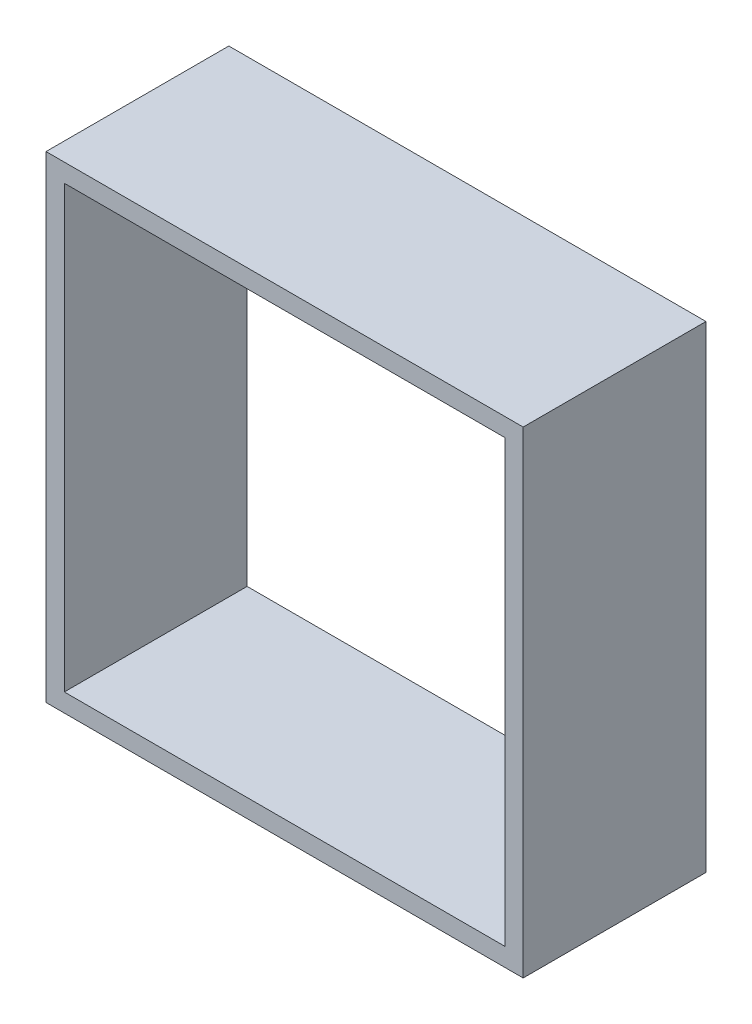
ISO-10303-21;
HEADER;
FILE_DESCRIPTION(('STEP AP214'),'2;1');
FILE_NAME('part.step','',(''),(''),'','','');
FILE_SCHEMA(('AUTOMOTIVE_DESIGN { 1 0 10303 214 1 1 1 1 }'));
ENDSEC;
DATA;
#1=APPLICATION_CONTEXT('core data for automotive mechanical design processes');
#2=APPLICATION_PROTOCOL_DEFINITION('international standard','automotive_design',2000,#1);
#3=PRODUCT_CONTEXT('',#1,'mechanical');
#4=PRODUCT('Part','Part','',(#3));
#5=PRODUCT_RELATED_PRODUCT_CATEGORY('part','',(#4));
#6=PRODUCT_DEFINITION_FORMATION('','',#4);
#7=PRODUCT_DEFINITION_CONTEXT('part definition',#1,'design');
#8=PRODUCT_DEFINITION('design','',#6,#7);
#9=PRODUCT_DEFINITION_SHAPE('','',#8);
#10=(LENGTH_UNIT() NAMED_UNIT(*) SI_UNIT(.MILLI.,.METRE.));
#11=(NAMED_UNIT(*) PLANE_ANGLE_UNIT() SI_UNIT($,.RADIAN.));
#12=(NAMED_UNIT(*) SI_UNIT($,.STERADIAN.) SOLID_ANGLE_UNIT());
#13=UNCERTAINTY_MEASURE_WITH_UNIT(LENGTH_MEASURE(1.E-05),#10,'distance_accuracy_value','');
#14=(GEOMETRIC_REPRESENTATION_CONTEXT(3) GLOBAL_UNCERTAINTY_ASSIGNED_CONTEXT((#13)) GLOBAL_UNIT_ASSIGNED_CONTEXT((#10,
#11,#12)) REPRESENTATION_CONTEXT('',''));
#15=CARTESIAN_POINT('',(0.,0.,0.));
#16=DIRECTION('',(0.,0.,1.));
#17=DIRECTION('',(1.,0.,0.));
#18=AXIS2_PLACEMENT_3D('',#15,#16,#17);
#19=CARTESIAN_POINT('',(0.,0.,5.));
#20=DIRECTION('',(0.,0.,1.));
#21=DIRECTION('',(1.,0.,0.));
#22=AXIS2_PLACEMENT_3D('',#19,#20,#21);
#23=PLANE('',#22);
#24=DIRECTION('',(1.,0.,0.));
#25=VECTOR('',#24,1.);
#26=CARTESIAN_POINT('',(-6.525,-6.525,5.));
#27=LINE('',#26,#25);
#28=CARTESIAN_POINT('',(-6.525,-6.525,5.));
#29=VERTEX_POINT('',#28);
#30=CARTESIAN_POINT('',(6.525,-6.525,5.));
#31=VERTEX_POINT('',#30);
#32=EDGE_CURVE('E134',#29,#31,#27,.T.);
#33=ORIENTED_EDGE('',*,*,#32,.T.);
#34=DIRECTION('',(0.,1.,0.));
#35=VECTOR('',#34,1.);
#36=CARTESIAN_POINT('',(6.525,-6.525,5.));
#37=LINE('',#36,#35);
#38=CARTESIAN_POINT('',(6.525,6.525,5.));
#39=VERTEX_POINT('',#38);
#40=EDGE_CURVE('E137',#31,#39,#37,.T.);
#41=ORIENTED_EDGE('',*,*,#40,.T.);
#42=DIRECTION('',(-1.,0.,0.));
#43=VECTOR('',#42,1.);
#44=CARTESIAN_POINT('',(-6.525,6.525,5.));
#45=LINE('',#44,#43);
#46=CARTESIAN_POINT('',(-6.525,6.525,5.));
#47=VERTEX_POINT('',#46);
#48=EDGE_CURVE('E140',#39,#47,#45,.T.);
#49=ORIENTED_EDGE('',*,*,#48,.T.);
#50=DIRECTION('',(0.,-1.,0.));
#51=VECTOR('',#50,1.);
#52=CARTESIAN_POINT('',(-6.525,-6.525,5.));
#53=LINE('',#52,#51);
#54=EDGE_CURVE('E142',#47,#29,#53,.T.);
#55=ORIENTED_EDGE('',*,*,#54,.T.);
#56=EDGE_LOOP('',(#33,#41,#49,#55));
#57=FACE_BOUND('',#56,.T.);
#58=DIRECTION('',(1.,0.,0.));
#59=VECTOR('',#58,1.);
#60=CARTESIAN_POINT('',(-6.025,-6.025,5.));
#61=LINE('',#60,#59);
#62=CARTESIAN_POINT('',(-6.025,-6.025,5.));
#63=VERTEX_POINT('',#62);
#64=CARTESIAN_POINT('',(6.025,-6.025,5.));
#65=VERTEX_POINT('',#64);
#66=EDGE_CURVE('E106',#63,#65,#61,.T.);
#67=ORIENTED_EDGE('',*,*,#66,.F.);
#68=DIRECTION('',(0.,-1.,0.));
#69=VECTOR('',#68,1.);
#70=CARTESIAN_POINT('',(-6.025,-6.025,5.));
#71=LINE('',#70,#69);
#72=CARTESIAN_POINT('',(-6.025,6.025,5.));
#73=VERTEX_POINT('',#72);
#74=EDGE_CURVE('E98',#73,#63,#71,.T.);
#75=ORIENTED_EDGE('',*,*,#74,.F.);
#76=DIRECTION('',(-1.,0.,0.));
#77=VECTOR('',#76,1.);
#78=CARTESIAN_POINT('',(-6.025,6.025,5.));
#79=LINE('',#78,#77);
#80=CARTESIAN_POINT('',(6.025,6.025,5.));
#81=VERTEX_POINT('',#80);
#82=EDGE_CURVE('E120',#81,#73,#79,.T.);
#83=ORIENTED_EDGE('',*,*,#82,.F.);
#84=DIRECTION('',(0.,1.,0.));
#85=VECTOR('',#84,1.);
#86=CARTESIAN_POINT('',(6.025,-6.025,5.));
#87=LINE('',#86,#85);
#88=EDGE_CURVE('E118',#65,#81,#87,.T.);
#89=ORIENTED_EDGE('',*,*,#88,.F.);
#90=EDGE_LOOP('',(#67,#75,#83,#89));
#91=FACE_BOUND('',#90,.T.);
#92=ADVANCED_FACE('F33',(#57,#91),#23,.T.);
#93=CARTESIAN_POINT('',(0.,0.,0.));
#94=DIRECTION('',(0.,0.,1.));
#95=DIRECTION('',(1.,0.,0.));
#96=AXIS2_PLACEMENT_3D('',#93,#94,#95);
#97=PLANE('',#96);
#98=DIRECTION('',(1.,0.,0.));
#99=VECTOR('',#98,1.);
#100=CARTESIAN_POINT('',(-6.525,-6.525,0.));
#101=LINE('',#100,#99);
#102=CARTESIAN_POINT('',(-6.525,-6.525,0.));
#103=VERTEX_POINT('',#102);
#104=CARTESIAN_POINT('',(6.525,-6.525,0.));
#105=VERTEX_POINT('',#104);
#106=EDGE_CURVE('E114',#103,#105,#101,.T.);
#107=ORIENTED_EDGE('',*,*,#106,.F.);
#108=DIRECTION('',(0.,-1.,0.));
#109=VECTOR('',#108,1.);
#110=CARTESIAN_POINT('',(-6.525,-6.525,0.));
#111=LINE('',#110,#109);
#112=CARTESIAN_POINT('',(-6.525,6.525,0.));
#113=VERTEX_POINT('',#112);
#114=EDGE_CURVE('E138',#113,#103,#111,.T.);
#115=ORIENTED_EDGE('',*,*,#114,.F.);
#116=DIRECTION('',(-1.,0.,0.));
#117=VECTOR('',#116,1.);
#118=CARTESIAN_POINT('',(-6.525,6.525,0.));
#119=LINE('',#118,#117);
#120=CARTESIAN_POINT('',(6.525,6.525,0.));
#121=VERTEX_POINT('',#120);
#122=EDGE_CURVE('E149',#121,#113,#119,.T.);
#123=ORIENTED_EDGE('',*,*,#122,.F.);
#124=DIRECTION('',(0.,1.,0.));
#125=VECTOR('',#124,1.);
#126=CARTESIAN_POINT('',(6.525,-6.525,0.));
#127=LINE('',#126,#125);
#128=EDGE_CURVE('E147',#105,#121,#127,.T.);
#129=ORIENTED_EDGE('',*,*,#128,.F.);
#130=EDGE_LOOP('',(#107,#115,#123,#129));
#131=FACE_BOUND('',#130,.T.);
#132=DIRECTION('',(0.,-1.,0.));
#133=VECTOR('',#132,1.);
#134=CARTESIAN_POINT('',(-6.025,-6.025,0.));
#135=LINE('',#134,#133);
#136=CARTESIAN_POINT('',(-6.025,6.025,0.));
#137=VERTEX_POINT('',#136);
#138=CARTESIAN_POINT('',(-6.025,-6.025,0.));
#139=VERTEX_POINT('',#138);
#140=EDGE_CURVE('E56',#137,#139,#135,.T.);
#141=ORIENTED_EDGE('',*,*,#140,.T.);
#142=DIRECTION('',(1.,0.,0.));
#143=VECTOR('',#142,1.);
#144=CARTESIAN_POINT('',(-6.025,-6.025,0.));
#145=LINE('',#144,#143);
#146=CARTESIAN_POINT('',(6.025,-6.025,0.));
#147=VERTEX_POINT('',#146);
#148=EDGE_CURVE('E113',#139,#147,#145,.T.);
#149=ORIENTED_EDGE('',*,*,#148,.T.);
#150=DIRECTION('',(0.,1.,0.));
#151=VECTOR('',#150,1.);
#152=CARTESIAN_POINT('',(6.025,-6.025,0.));
#153=LINE('',#152,#151);
#154=CARTESIAN_POINT('',(6.025,6.025,0.));
#155=VERTEX_POINT('',#154);
#156=EDGE_CURVE('E126',#147,#155,#153,.T.);
#157=ORIENTED_EDGE('',*,*,#156,.T.);
#158=DIRECTION('',(-1.,0.,0.));
#159=VECTOR('',#158,1.);
#160=CARTESIAN_POINT('',(-6.025,6.025,0.));
#161=LINE('',#160,#159);
#162=EDGE_CURVE('E107',#155,#137,#161,.T.);
#163=ORIENTED_EDGE('',*,*,#162,.T.);
#164=EDGE_LOOP('',(#141,#149,#157,#163));
#165=FACE_BOUND('',#164,.T.);
#166=ADVANCED_FACE('F167',(#131,#165),#97,.F.);
#167=CARTESIAN_POINT('',(-6.525,-6.525,5.));
#168=DIRECTION('',(0.,1.,0.));
#169=DIRECTION('',(0.,0.,1.));
#170=AXIS2_PLACEMENT_3D('',#167,#168,#169);
#171=PLANE('',#170);
#172=ORIENTED_EDGE('',*,*,#106,.T.);
#173=DIRECTION('',(0.,0.,-1.));
#174=VECTOR('',#173,1.);
#175=CARTESIAN_POINT('',(6.525,-6.525,5.));
#176=LINE('',#175,#174);
#177=EDGE_CURVE('E11',#31,#105,#176,.T.);
#178=ORIENTED_EDGE('',*,*,#177,.F.);
#179=ORIENTED_EDGE('',*,*,#32,.F.);
#180=DIRECTION('',(0.,0.,-1.));
#181=VECTOR('',#180,1.);
#182=CARTESIAN_POINT('',(-6.525,-6.525,5.));
#183=LINE('',#182,#181);
#184=EDGE_CURVE('E144',#29,#103,#183,.T.);
#185=ORIENTED_EDGE('',*,*,#184,.T.);
#186=EDGE_LOOP('',(#172,#178,#179,#185));
#187=FACE_BOUND('',#186,.T.);
#188=ADVANCED_FACE('F35',(#187),#171,.F.);
#189=CARTESIAN_POINT('',(6.525,-6.525,5.));
#190=DIRECTION('',(-1.,0.,0.));
#191=DIRECTION('',(0.,-1.,0.));
#192=AXIS2_PLACEMENT_3D('',#189,#190,#191);
#193=PLANE('',#192);
#194=ORIENTED_EDGE('',*,*,#128,.T.);
#195=DIRECTION('',(0.,0.,-1.));
#196=VECTOR('',#195,1.);
#197=CARTESIAN_POINT('',(6.525,6.525,5.));
#198=LINE('',#197,#196);
#199=EDGE_CURVE('E41',#39,#121,#198,.T.);
#200=ORIENTED_EDGE('',*,*,#199,.F.);
#201=ORIENTED_EDGE('',*,*,#40,.F.);
#202=ORIENTED_EDGE('',*,*,#177,.T.);
#203=EDGE_LOOP('',(#194,#200,#201,#202));
#204=FACE_BOUND('',#203,.T.);
#205=ADVANCED_FACE('F177',(#204),#193,.F.);
#206=CARTESIAN_POINT('',(-6.525,6.525,5.));
#207=DIRECTION('',(0.,-1.,0.));
#208=DIRECTION('',(0.,0.,-1.));
#209=AXIS2_PLACEMENT_3D('',#206,#207,#208);
#210=PLANE('',#209);
#211=ORIENTED_EDGE('',*,*,#122,.T.);
#212=DIRECTION('',(0.,0.,-1.));
#213=VECTOR('',#212,1.);
#214=CARTESIAN_POINT('',(-6.525,6.525,5.));
#215=LINE('',#214,#213);
#216=EDGE_CURVE('E154',#47,#113,#215,.T.);
#217=ORIENTED_EDGE('',*,*,#216,.F.);
#218=ORIENTED_EDGE('',*,*,#48,.F.);
#219=ORIENTED_EDGE('',*,*,#199,.T.);
#220=EDGE_LOOP('',(#211,#217,#218,#219));
#221=FACE_BOUND('',#220,.T.);
#222=ADVANCED_FACE('F161',(#221),#210,.F.);
#223=CARTESIAN_POINT('',(-6.525,-6.525,5.));
#224=DIRECTION('',(1.,0.,0.));
#225=DIRECTION('',(0.,0.,-1.));
#226=AXIS2_PLACEMENT_3D('',#223,#224,#225);
#227=PLANE('',#226);
#228=ORIENTED_EDGE('',*,*,#114,.T.);
#229=ORIENTED_EDGE('',*,*,#184,.F.);
#230=ORIENTED_EDGE('',*,*,#54,.F.);
#231=ORIENTED_EDGE('',*,*,#216,.T.);
#232=EDGE_LOOP('',(#228,#229,#230,#231));
#233=FACE_BOUND('',#232,.T.);
#234=ADVANCED_FACE('F171',(#233),#227,.F.);
#235=CARTESIAN_POINT('',(-6.025,-6.025,5.));
#236=DIRECTION('',(1.,0.,0.));
#237=DIRECTION('',(0.,0.,-1.));
#238=AXIS2_PLACEMENT_3D('',#235,#236,#237);
#239=PLANE('',#238);
#240=ORIENTED_EDGE('',*,*,#140,.F.);
#241=DIRECTION('',(0.,0.,-1.));
#242=VECTOR('',#241,1.);
#243=CARTESIAN_POINT('',(-6.025,6.025,5.));
#244=LINE('',#243,#242);
#245=EDGE_CURVE('E102',#73,#137,#244,.T.);
#246=ORIENTED_EDGE('',*,*,#245,.F.);
#247=ORIENTED_EDGE('',*,*,#74,.T.);
#248=DIRECTION('',(0.,0.,-1.));
#249=VECTOR('',#248,1.);
#250=CARTESIAN_POINT('',(-6.025,-6.025,5.));
#251=LINE('',#250,#249);
#252=EDGE_CURVE('E101',#63,#139,#251,.T.);
#253=ORIENTED_EDGE('',*,*,#252,.T.);
#254=EDGE_LOOP('',(#240,#246,#247,#253));
#255=FACE_BOUND('',#254,.T.);
#256=ADVANCED_FACE('F100',(#255),#239,.T.);
#257=CARTESIAN_POINT('',(-6.025,-6.025,5.));
#258=DIRECTION('',(0.,1.,0.));
#259=DIRECTION('',(0.,0.,1.));
#260=AXIS2_PLACEMENT_3D('',#257,#258,#259);
#261=PLANE('',#260);
#262=ORIENTED_EDGE('',*,*,#148,.F.);
#263=ORIENTED_EDGE('',*,*,#252,.F.);
#264=ORIENTED_EDGE('',*,*,#66,.T.);
#265=DIRECTION('',(0.,0.,-1.));
#266=VECTOR('',#265,1.);
#267=CARTESIAN_POINT('',(6.025,-6.025,5.));
#268=LINE('',#267,#266);
#269=EDGE_CURVE('E115',#65,#147,#268,.T.);
#270=ORIENTED_EDGE('',*,*,#269,.T.);
#271=EDGE_LOOP('',(#262,#263,#264,#270));
#272=FACE_BOUND('',#271,.T.);
#273=ADVANCED_FACE('F110',(#272),#261,.T.);
#274=CARTESIAN_POINT('',(6.025,-6.025,5.));
#275=DIRECTION('',(-1.,0.,0.));
#276=DIRECTION('',(0.,0.,1.));
#277=AXIS2_PLACEMENT_3D('',#274,#275,#276);
#278=PLANE('',#277);
#279=ORIENTED_EDGE('',*,*,#156,.F.);
#280=ORIENTED_EDGE('',*,*,#269,.F.);
#281=ORIENTED_EDGE('',*,*,#88,.T.);
#282=DIRECTION('',(0.,0.,-1.));
#283=VECTOR('',#282,1.);
#284=CARTESIAN_POINT('',(6.025,6.025,5.));
#285=LINE('',#284,#283);
#286=EDGE_CURVE('E48',#81,#155,#285,.T.);
#287=ORIENTED_EDGE('',*,*,#286,.T.);
#288=EDGE_LOOP('',(#279,#280,#281,#287));
#289=FACE_BOUND('',#288,.T.);
#290=ADVANCED_FACE('F200',(#289),#278,.T.);
#291=CARTESIAN_POINT('',(-6.025,6.025,5.));
#292=DIRECTION('',(0.,-1.,0.));
#293=DIRECTION('',(0.,0.,-1.));
#294=AXIS2_PLACEMENT_3D('',#291,#292,#293);
#295=PLANE('',#294);
#296=ORIENTED_EDGE('',*,*,#162,.F.);
#297=ORIENTED_EDGE('',*,*,#286,.F.);
#298=ORIENTED_EDGE('',*,*,#82,.T.);
#299=ORIENTED_EDGE('',*,*,#245,.T.);
#300=EDGE_LOOP('',(#296,#297,#298,#299));
#301=FACE_BOUND('',#300,.T.);
#302=ADVANCED_FACE('F204',(#301),#295,.T.);
#303=CLOSED_SHELL('',(#92,#166,#188,#205,#222,#234,#256,#273,#290,#302));
#304=MANIFOLD_SOLID_BREP('B2',#303);
#305=ADVANCED_BREP_SHAPE_REPRESENTATION('',(#18,#304),#14);
#306=SHAPE_DEFINITION_REPRESENTATION(#9,#305);
ENDSEC;
END-ISO-10303-21;
